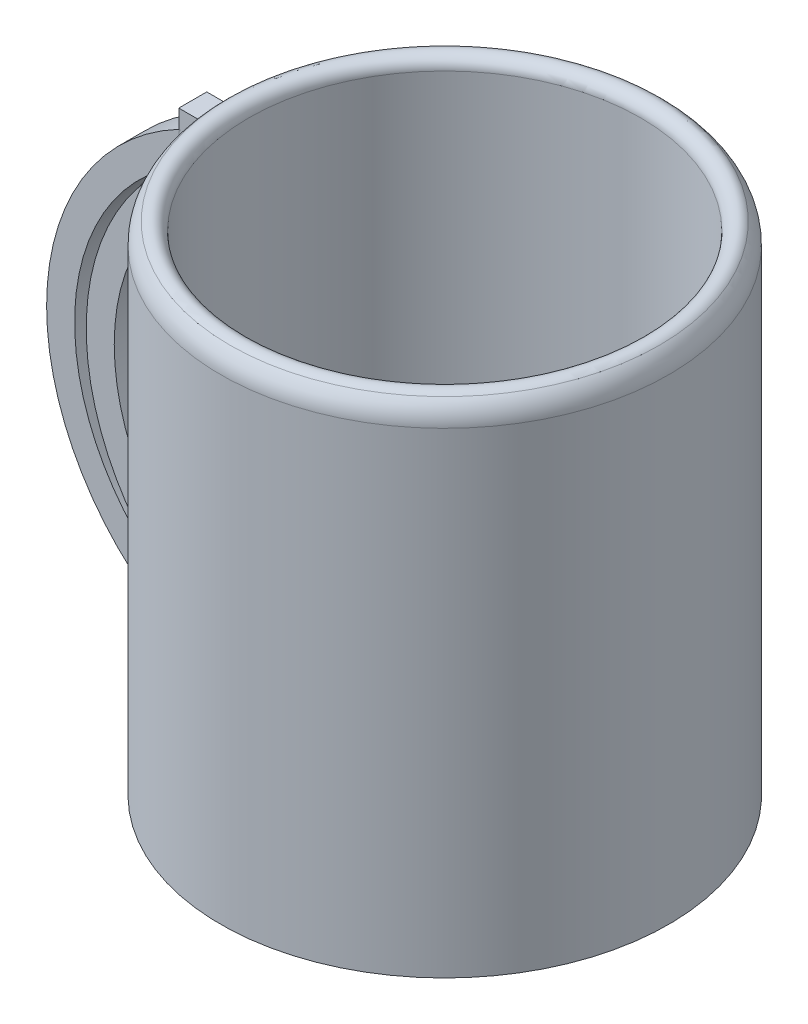
ISO-10303-21;
HEADER;
FILE_DESCRIPTION(('STEP AP214'),'2;1');
FILE_NAME('part.step','',(''),(''),'','','');
FILE_SCHEMA(('AUTOMOTIVE_DESIGN { 1 0 10303 214 1 1 1 1 }'));
ENDSEC;
DATA;
#1=APPLICATION_CONTEXT('core data for automotive mechanical design processes');
#2=APPLICATION_PROTOCOL_DEFINITION('international standard','automotive_design',2000,#1);
#3=PRODUCT_CONTEXT('',#1,'mechanical');
#4=PRODUCT('Part','Part','',(#3));
#5=PRODUCT_RELATED_PRODUCT_CATEGORY('part','',(#4));
#6=PRODUCT_DEFINITION_FORMATION('','',#4);
#7=PRODUCT_DEFINITION_CONTEXT('part definition',#1,'design');
#8=PRODUCT_DEFINITION('design','',#6,#7);
#9=PRODUCT_DEFINITION_SHAPE('','',#8);
#10=(LENGTH_UNIT() NAMED_UNIT(*) SI_UNIT(.MILLI.,.METRE.));
#11=(NAMED_UNIT(*) PLANE_ANGLE_UNIT() SI_UNIT($,.RADIAN.));
#12=(NAMED_UNIT(*) SI_UNIT($,.STERADIAN.) SOLID_ANGLE_UNIT());
#13=UNCERTAINTY_MEASURE_WITH_UNIT(LENGTH_MEASURE(1.E-05),#10,'distance_accuracy_value','');
#14=(GEOMETRIC_REPRESENTATION_CONTEXT(3) GLOBAL_UNCERTAINTY_ASSIGNED_CONTEXT((#13)) GLOBAL_UNIT_ASSIGNED_CONTEXT((#10,
#11,#12)) REPRESENTATION_CONTEXT('',''));
#15=CARTESIAN_POINT('',(0.,0.,0.));
#16=DIRECTION('',(0.,0.,1.));
#17=DIRECTION('',(1.,0.,0.));
#18=AXIS2_PLACEMENT_3D('',#15,#16,#17);
#19=CARTESIAN_POINT('',(-24.3812589804057,42.6071533146474,2.5));
#20=DIRECTION('',(0.,0.,-1.));
#21=DIRECTION('',(-1.,0.,0.));
#22=AXIS2_PLACEMENT_3D('',#19,#20,#21);
#23=CYLINDRICAL_SURFACE('',#22,44.2149505588136);
#24=CARTESIAN_POINT('',(-24.3812589804057,42.6071533146474,-2.5));
#25=DIRECTION('',(0.,0.,1.));
#26=DIRECTION('',(1.,0.,0.));
#27=AXIS2_PLACEMENT_3D('',#24,#25,#26);
#28=CIRCLE('',#27,44.2149505588136);
#29=CARTESIAN_POINT('',(-41.9914268406599,83.1638277450294,-2.5));
#30=VERTEX_POINT('',#29);
#31=CARTESIAN_POINT('',(-41.9914268406599,2.05047888426536,-2.5));
#32=VERTEX_POINT('',#31);
#33=EDGE_CURVE('E189',#30,#32,#28,.T.);
#34=ORIENTED_EDGE('',*,*,#33,.T.);
#35=DIRECTION('',(0.,0.,-1.));
#36=VECTOR('',#35,1.);
#37=CARTESIAN_POINT('',(-41.9914268406599,2.05047888426536,2.5));
#38=LINE('',#37,#36);
#39=CARTESIAN_POINT('',(-41.9914268406599,2.05047888426536,2.5));
#40=VERTEX_POINT('',#39);
#41=EDGE_CURVE('E13',#40,#32,#38,.T.);
#42=ORIENTED_EDGE('',*,*,#41,.F.);
#43=CARTESIAN_POINT('',(-24.3812589804057,42.6071533146474,2.5));
#44=DIRECTION('',(0.,0.,1.));
#45=DIRECTION('',(1.,0.,0.));
#46=AXIS2_PLACEMENT_3D('',#43,#44,#45);
#47=CIRCLE('',#46,44.2149505588136);
#48=CARTESIAN_POINT('',(-41.9914268406599,83.1638277450294,2.5));
#49=VERTEX_POINT('',#48);
#50=EDGE_CURVE('E166',#49,#40,#47,.T.);
#51=ORIENTED_EDGE('',*,*,#50,.F.);
#52=DIRECTION('',(0.,0.,-1.));
#53=VECTOR('',#52,1.);
#54=CARTESIAN_POINT('',(-41.9914268406599,83.1638277450294,2.5));
#55=LINE('',#54,#53);
#56=EDGE_CURVE('E142',#49,#30,#55,.T.);
#57=ORIENTED_EDGE('',*,*,#56,.T.);
#58=EDGE_LOOP('',(#34,#42,#51,#57));
#59=FACE_BOUND('',#58,.T.);
#60=ADVANCED_FACE('F126',(#59),#23,.T.);
#61=CARTESIAN_POINT('',(-40.,6.63678667357686,2.5));
#62=DIRECTION('',(0.917261557862301,-0.398285368131976,0.));
#63=DIRECTION('',(0.398285368131976,0.917261557862301,0.));
#64=AXIS2_PLACEMENT_3D('',#61,#62,#63);
#65=PLANE('',#64);
#66=DIRECTION('',(-0.398285368131976,-0.917261557862301,0.));
#67=VECTOR('',#66,1.);
#68=CARTESIAN_POINT('',(-40.,6.63678667357686,-2.5));
#69=LINE('',#68,#67);
#70=CARTESIAN_POINT('',(-40.,6.63678667357686,-2.5));
#71=VERTEX_POINT('',#70);
#72=EDGE_CURVE('E175',#71,#32,#69,.T.);
#73=ORIENTED_EDGE('',*,*,#72,.F.);
#74=DIRECTION('',(0.,0.,-1.));
#75=VECTOR('',#74,1.);
#76=CARTESIAN_POINT('',(-40.,6.63678667357686,2.5));
#77=LINE('',#76,#75);
#78=CARTESIAN_POINT('',(-40.,6.63678667357686,2.5));
#79=VERTEX_POINT('',#78);
#80=EDGE_CURVE('E134',#79,#71,#77,.T.);
#81=ORIENTED_EDGE('',*,*,#80,.F.);
#82=DIRECTION('',(-0.398285368131976,-0.917261557862301,0.));
#83=VECTOR('',#82,1.);
#84=CARTESIAN_POINT('',(-40.,6.63678667357686,2.5));
#85=LINE('',#84,#83);
#86=EDGE_CURVE('E173',#79,#40,#85,.T.);
#87=ORIENTED_EDGE('',*,*,#86,.T.);
#88=ORIENTED_EDGE('',*,*,#41,.T.);
#89=EDGE_LOOP('',(#73,#81,#87,#88));
#90=FACE_BOUND('',#89,.T.);
#91=ADVANCED_FACE('F172',(#90),#65,.T.);
#92=CARTESIAN_POINT('',(-24.3812589804057,42.6071533146474,2.5));
#93=DIRECTION('',(0.,0.,-1.));
#94=DIRECTION('',(-1.,0.,0.));
#95=AXIS2_PLACEMENT_3D('',#92,#93,#94);
#96=CYLINDRICAL_SURFACE('',#95,39.2149505588136);
#97=CARTESIAN_POINT('',(-24.3812589804057,42.6071533146474,-2.5));
#98=DIRECTION('',(0.,0.,1.));
#99=DIRECTION('',(1.,0.,0.));
#100=AXIS2_PLACEMENT_3D('',#97,#98,#99);
#101=CIRCLE('',#100,39.2149505588136);
#102=CARTESIAN_POINT('',(-40.,78.5775199557179,-2.5));
#103=VERTEX_POINT('',#102);
#104=EDGE_CURVE('E192',#103,#71,#101,.T.);
#105=ORIENTED_EDGE('',*,*,#104,.F.);
#106=DIRECTION('',(0.,0.,-1.));
#107=VECTOR('',#106,1.);
#108=CARTESIAN_POINT('',(-40.,78.5775199557179,2.5));
#109=LINE('',#108,#107);
#110=CARTESIAN_POINT('',(-40.,78.5775199557179,2.5));
#111=VERTEX_POINT('',#110);
#112=EDGE_CURVE('E155',#111,#103,#109,.T.);
#113=ORIENTED_EDGE('',*,*,#112,.F.);
#114=CARTESIAN_POINT('',(-24.3812589804057,42.6071533146474,2.5));
#115=DIRECTION('',(0.,0.,1.));
#116=DIRECTION('',(1.,0.,0.));
#117=AXIS2_PLACEMENT_3D('',#114,#115,#116);
#118=CIRCLE('',#117,39.2149505588136);
#119=EDGE_CURVE('E181',#111,#79,#118,.T.);
#120=ORIENTED_EDGE('',*,*,#119,.T.);
#121=ORIENTED_EDGE('',*,*,#80,.T.);
#122=EDGE_LOOP('',(#105,#113,#120,#121));
#123=FACE_BOUND('',#122,.T.);
#124=ADVANCED_FACE('F183',(#123),#96,.F.);
#125=CARTESIAN_POINT('',(-41.9914268406599,83.1638277450294,2.5));
#126=DIRECTION('',(0.917261557862302,0.398285368131974,0.));
#127=DIRECTION('',(-0.398285368131974,0.917261557862302,0.));
#128=AXIS2_PLACEMENT_3D('',#125,#126,#127);
#129=PLANE('',#128);
#130=DIRECTION('',(0.398285368131974,-0.917261557862302,0.));
#131=VECTOR('',#130,1.);
#132=CARTESIAN_POINT('',(-41.9914268406599,83.1638277450294,-2.5));
#133=LINE('',#132,#131);
#134=EDGE_CURVE('E194',#30,#103,#133,.T.);
#135=ORIENTED_EDGE('',*,*,#134,.F.);
#136=ORIENTED_EDGE('',*,*,#56,.F.);
#137=DIRECTION('',(0.398285368131974,-0.917261557862302,0.));
#138=VECTOR('',#137,1.);
#139=CARTESIAN_POINT('',(-41.9914268406599,83.1638277450294,2.5));
#140=LINE('',#139,#138);
#141=EDGE_CURVE('E184',#49,#111,#140,.T.);
#142=ORIENTED_EDGE('',*,*,#141,.T.);
#143=ORIENTED_EDGE('',*,*,#112,.T.);
#144=EDGE_LOOP('',(#135,#136,#142,#143));
#145=FACE_BOUND('',#144,.T.);
#146=ADVANCED_FACE('F200',(#145),#129,.T.);
#147=CARTESIAN_POINT('',(-24.3812589804057,42.6071533146474,2.5));
#148=DIRECTION('',(0.,0.,1.));
#149=DIRECTION('',(1.,0.,0.));
#150=AXIS2_PLACEMENT_3D('',#147,#148,#149);
#151=PLANE('',#150);
#152=ORIENTED_EDGE('',*,*,#50,.T.);
#153=ORIENTED_EDGE('',*,*,#86,.F.);
#154=ORIENTED_EDGE('',*,*,#119,.F.);
#155=ORIENTED_EDGE('',*,*,#141,.F.);
#156=EDGE_LOOP('',(#152,#153,#154,#155));
#157=FACE_BOUND('',#156,.T.);
#158=ADVANCED_FACE('F180',(#157),#151,.T.);
#159=CARTESIAN_POINT('',(-24.3812589804057,42.6071533146474,-2.5));
#160=DIRECTION('',(0.,0.,1.));
#161=DIRECTION('',(1.,0.,0.));
#162=AXIS2_PLACEMENT_3D('',#159,#160,#161);
#163=PLANE('',#162);
#164=ORIENTED_EDGE('',*,*,#33,.F.);
#165=ORIENTED_EDGE('',*,*,#134,.T.);
#166=ORIENTED_EDGE('',*,*,#104,.T.);
#167=ORIENTED_EDGE('',*,*,#72,.T.);
#168=EDGE_LOOP('',(#164,#165,#166,#167));
#169=FACE_BOUND('',#168,.T.);
#170=ADVANCED_FACE('F199',(#169),#163,.F.);
#171=CLOSED_SHELL('',(#60,#91,#124,#146,#158,#170));
#172=MANIFOLD_SOLID_BREP('B2',#171);
#173=CARTESIAN_POINT('',(-19.3818792111372,42.6859056011428,2.5));
#174=DIRECTION('',(0.,0.,-1.));
#175=DIRECTION('',(-1.,0.,0.));
#176=AXIS2_PLACEMENT_3D('',#173,#174,#175);
#177=CYLINDRICAL_SURFACE('',#176,42.1402577036822);
#178=CARTESIAN_POINT('',(-19.3818792111372,42.6859056011428,-2.5));
#179=DIRECTION('',(0.,0.,1.));
#180=DIRECTION('',(1.,0.,0.));
#181=AXIS2_PLACEMENT_3D('',#178,#179,#180);
#182=CIRCLE('',#181,42.1402577036822);
#183=CARTESIAN_POINT('',(-42.7757105178646,77.7362975550871,-2.5));
#184=VERTEX_POINT('',#183);
#185=CARTESIAN_POINT('',(-42.7757105178647,7.63551364719855,-2.5));
#186=VERTEX_POINT('',#185);
#187=EDGE_CURVE('E323',#184,#186,#182,.T.);
#188=ORIENTED_EDGE('',*,*,#187,.T.);
#189=DIRECTION('',(0.,0.,-1.));
#190=VECTOR('',#189,1.);
#191=CARTESIAN_POINT('',(-42.7757105178647,7.63551364719855,2.5));
#192=LINE('',#191,#190);
#193=CARTESIAN_POINT('',(-42.7757105178647,7.63551364719855,2.5));
#194=VERTEX_POINT('',#193);
#195=EDGE_CURVE('E124',#194,#186,#192,.T.);
#196=ORIENTED_EDGE('',*,*,#195,.F.);
#197=CARTESIAN_POINT('',(-19.3818792111372,42.6859056011428,2.5));
#198=DIRECTION('',(0.,0.,1.));
#199=DIRECTION('',(1.,0.,0.));
#200=AXIS2_PLACEMENT_3D('',#197,#198,#199);
#201=CIRCLE('',#200,42.1402577036822);
#202=CARTESIAN_POINT('',(-42.7757105178646,77.7362975550871,2.5));
#203=VERTEX_POINT('',#202);
#204=EDGE_CURVE('E300',#203,#194,#201,.T.);
#205=ORIENTED_EDGE('',*,*,#204,.F.);
#206=DIRECTION('',(0.,0.,-1.));
#207=VECTOR('',#206,1.);
#208=CARTESIAN_POINT('',(-42.7757105178646,77.7362975550871,2.5));
#209=LINE('',#208,#207);
#210=EDGE_CURVE('E276',#203,#184,#209,.T.);
#211=ORIENTED_EDGE('',*,*,#210,.T.);
#212=EDGE_LOOP('',(#188,#196,#205,#211));
#213=FACE_BOUND('',#212,.T.);
#214=ADVANCED_FACE('F260',(#213),#177,.T.);
#215=CARTESIAN_POINT('',(-40.,11.7942912465678,2.5));
#216=DIRECTION('',(0.831755519873848,-0.555142103572936,0.));
#217=DIRECTION('',(0.555142103572936,0.831755519873848,0.));
#218=AXIS2_PLACEMENT_3D('',#215,#216,#217);
#219=PLANE('',#218);
#220=DIRECTION('',(-0.555142103572936,-0.831755519873848,0.));
#221=VECTOR('',#220,1.);
#222=CARTESIAN_POINT('',(-40.,11.7942912465678,-2.5));
#223=LINE('',#222,#221);
#224=CARTESIAN_POINT('',(-40.,11.7942912465678,-2.5));
#225=VERTEX_POINT('',#224);
#226=EDGE_CURVE('E309',#225,#186,#223,.T.);
#227=ORIENTED_EDGE('',*,*,#226,.F.);
#228=DIRECTION('',(0.,0.,-1.));
#229=VECTOR('',#228,1.);
#230=CARTESIAN_POINT('',(-40.,11.7942912465678,2.5));
#231=LINE('',#230,#229);
#232=CARTESIAN_POINT('',(-40.,11.7942912465678,2.5));
#233=VERTEX_POINT('',#232);
#234=EDGE_CURVE('E268',#233,#225,#231,.T.);
#235=ORIENTED_EDGE('',*,*,#234,.F.);
#236=DIRECTION('',(-0.555142103572936,-0.831755519873848,0.));
#237=VECTOR('',#236,1.);
#238=CARTESIAN_POINT('',(-40.,11.7942912465678,2.5));
#239=LINE('',#238,#237);
#240=EDGE_CURVE('E307',#233,#194,#239,.T.);
#241=ORIENTED_EDGE('',*,*,#240,.T.);
#242=ORIENTED_EDGE('',*,*,#195,.T.);
#243=EDGE_LOOP('',(#227,#235,#241,#242));
#244=FACE_BOUND('',#243,.T.);
#245=ADVANCED_FACE('F306',(#244),#219,.T.);
#246=CARTESIAN_POINT('',(-19.3818792111372,42.6859056011428,2.5));
#247=DIRECTION('',(0.,0.,-1.));
#248=DIRECTION('',(-1.,0.,0.));
#249=AXIS2_PLACEMENT_3D('',#246,#247,#248);
#250=CYLINDRICAL_SURFACE('',#249,37.1402577036822);
#251=CARTESIAN_POINT('',(-19.3818792111372,42.6859056011428,-2.5));
#252=DIRECTION('',(0.,0.,1.));
#253=DIRECTION('',(1.,0.,0.));
#254=AXIS2_PLACEMENT_3D('',#251,#252,#253);
#255=CIRCLE('',#254,37.1402577036822);
#256=CARTESIAN_POINT('',(-40.,73.5775199557179,-2.5));
#257=VERTEX_POINT('',#256);
#258=EDGE_CURVE('E326',#257,#225,#255,.T.);
#259=ORIENTED_EDGE('',*,*,#258,.F.);
#260=DIRECTION('',(0.,0.,-1.));
#261=VECTOR('',#260,1.);
#262=CARTESIAN_POINT('',(-40.,73.5775199557179,2.5));
#263=LINE('',#262,#261);
#264=CARTESIAN_POINT('',(-40.,73.5775199557179,2.5));
#265=VERTEX_POINT('',#264);
#266=EDGE_CURVE('E289',#265,#257,#263,.T.);
#267=ORIENTED_EDGE('',*,*,#266,.F.);
#268=CARTESIAN_POINT('',(-19.3818792111372,42.6859056011428,2.5));
#269=DIRECTION('',(0.,0.,1.));
#270=DIRECTION('',(1.,0.,0.));
#271=AXIS2_PLACEMENT_3D('',#268,#269,#270);
#272=CIRCLE('',#271,37.1402577036822);
#273=EDGE_CURVE('E315',#265,#233,#272,.T.);
#274=ORIENTED_EDGE('',*,*,#273,.T.);
#275=ORIENTED_EDGE('',*,*,#234,.T.);
#276=EDGE_LOOP('',(#259,#267,#274,#275));
#277=FACE_BOUND('',#276,.T.);
#278=ADVANCED_FACE('F317',(#277),#250,.F.);
#279=CARTESIAN_POINT('',(-42.7757105178646,77.7362975550871,2.5));
#280=DIRECTION('',(0.831755519873853,0.555142103572929,0.));
#281=DIRECTION('',(-0.555142103572929,0.831755519873853,0.));
#282=AXIS2_PLACEMENT_3D('',#279,#280,#281);
#283=PLANE('',#282);
#284=DIRECTION('',(0.555142103572929,-0.831755519873853,0.));
#285=VECTOR('',#284,1.);
#286=CARTESIAN_POINT('',(-42.7757105178646,77.7362975550871,-2.5));
#287=LINE('',#286,#285);
#288=EDGE_CURVE('E328',#184,#257,#287,.T.);
#289=ORIENTED_EDGE('',*,*,#288,.F.);
#290=ORIENTED_EDGE('',*,*,#210,.F.);
#291=DIRECTION('',(0.555142103572929,-0.831755519873853,0.));
#292=VECTOR('',#291,1.);
#293=CARTESIAN_POINT('',(-42.7757105178646,77.7362975550871,2.5));
#294=LINE('',#293,#292);
#295=EDGE_CURVE('E318',#203,#265,#294,.T.);
#296=ORIENTED_EDGE('',*,*,#295,.T.);
#297=ORIENTED_EDGE('',*,*,#266,.T.);
#298=EDGE_LOOP('',(#289,#290,#296,#297));
#299=FACE_BOUND('',#298,.T.);
#300=ADVANCED_FACE('F334',(#299),#283,.T.);
#301=CARTESIAN_POINT('',(-19.3818792111372,42.6859056011428,2.5));
#302=DIRECTION('',(0.,0.,1.));
#303=DIRECTION('',(1.,0.,0.));
#304=AXIS2_PLACEMENT_3D('',#301,#302,#303);
#305=PLANE('',#304);
#306=ORIENTED_EDGE('',*,*,#204,.T.);
#307=ORIENTED_EDGE('',*,*,#240,.F.);
#308=ORIENTED_EDGE('',*,*,#273,.F.);
#309=ORIENTED_EDGE('',*,*,#295,.F.);
#310=EDGE_LOOP('',(#306,#307,#308,#309));
#311=FACE_BOUND('',#310,.T.);
#312=ADVANCED_FACE('F314',(#311),#305,.T.);
#313=CARTESIAN_POINT('',(-19.3818792111372,42.6859056011428,-2.5));
#314=DIRECTION('',(0.,0.,1.));
#315=DIRECTION('',(1.,0.,0.));
#316=AXIS2_PLACEMENT_3D('',#313,#314,#315);
#317=PLANE('',#316);
#318=ORIENTED_EDGE('',*,*,#187,.F.);
#319=ORIENTED_EDGE('',*,*,#288,.T.);
#320=ORIENTED_EDGE('',*,*,#258,.T.);
#321=ORIENTED_EDGE('',*,*,#226,.T.);
#322=EDGE_LOOP('',(#318,#319,#320,#321));
#323=FACE_BOUND('',#322,.T.);
#324=ADVANCED_FACE('F333',(#323),#317,.F.);
#325=CLOSED_SHELL('',(#214,#245,#278,#300,#312,#324));
#326=MANIFOLD_SOLID_BREP('B7',#325);
#327=CARTESIAN_POINT('',(-45.,85.,2.5));
#328=DIRECTION('',(1.,0.,0.));
#329=DIRECTION('',(0.,1.,0.));
#330=AXIS2_PLACEMENT_3D('',#327,#328,#329);
#331=PLANE('',#330);
#332=DIRECTION('',(0.,-1.,0.));
#333=VECTOR('',#332,1.);
#334=CARTESIAN_POINT('',(-45.,85.,-2.5));
#335=LINE('',#334,#333);
#336=CARTESIAN_POINT('',(-45.,85.,-2.5));
#337=VERTEX_POINT('',#336);
#338=CARTESIAN_POINT('',(-45.,0.,-2.5));
#339=VERTEX_POINT('',#338);
#340=EDGE_CURVE('E456',#337,#339,#335,.T.);
#341=ORIENTED_EDGE('',*,*,#340,.T.);
#342=DIRECTION('',(0.,0.,-1.));
#343=VECTOR('',#342,1.);
#344=CARTESIAN_POINT('',(-45.,0.,2.5));
#345=LINE('',#344,#343);
#346=CARTESIAN_POINT('',(-45.,0.,2.5));
#347=VERTEX_POINT('',#346);
#348=EDGE_CURVE('E258',#347,#339,#345,.T.);
#349=ORIENTED_EDGE('',*,*,#348,.F.);
#350=DIRECTION('',(0.,-1.,0.));
#351=VECTOR('',#350,1.);
#352=CARTESIAN_POINT('',(-45.,85.,2.5));
#353=LINE('',#352,#351);
#354=CARTESIAN_POINT('',(-45.,85.,2.5));
#355=VERTEX_POINT('',#354);
#356=EDGE_CURVE('E433',#355,#347,#353,.T.);
#357=ORIENTED_EDGE('',*,*,#356,.F.);
#358=DIRECTION('',(0.,0.,-1.));
#359=VECTOR('',#358,1.);
#360=CARTESIAN_POINT('',(-45.,85.,2.5));
#361=LINE('',#360,#359);
#362=EDGE_CURVE('E409',#355,#337,#361,.T.);
#363=ORIENTED_EDGE('',*,*,#362,.T.);
#364=EDGE_LOOP('',(#341,#349,#357,#363));
#365=FACE_BOUND('',#364,.T.);
#366=ADVANCED_FACE('F393',(#365),#331,.F.);
#367=CARTESIAN_POINT('',(-40.,0.,2.5));
#368=DIRECTION('',(0.,-1.,0.));
#369=DIRECTION('',(0.,0.,-1.));
#370=AXIS2_PLACEMENT_3D('',#367,#368,#369);
#371=PLANE('',#370);
#372=DIRECTION('',(-1.,0.,0.));
#373=VECTOR('',#372,1.);
#374=CARTESIAN_POINT('',(-40.,0.,-2.5));
#375=LINE('',#374,#373);
#376=CARTESIAN_POINT('',(-40.,0.,-2.5));
#377=VERTEX_POINT('',#376);
#378=EDGE_CURVE('E442',#377,#339,#375,.T.);
#379=ORIENTED_EDGE('',*,*,#378,.F.);
#380=DIRECTION('',(0.,0.,-1.));
#381=VECTOR('',#380,1.);
#382=CARTESIAN_POINT('',(-40.,0.,2.5));
#383=LINE('',#382,#381);
#384=CARTESIAN_POINT('',(-40.,0.,2.5));
#385=VERTEX_POINT('',#384);
#386=EDGE_CURVE('E401',#385,#377,#383,.T.);
#387=ORIENTED_EDGE('',*,*,#386,.F.);
#388=DIRECTION('',(-1.,0.,0.));
#389=VECTOR('',#388,1.);
#390=CARTESIAN_POINT('',(-40.,0.,2.5));
#391=LINE('',#390,#389);
#392=EDGE_CURVE('E440',#385,#347,#391,.T.);
#393=ORIENTED_EDGE('',*,*,#392,.T.);
#394=ORIENTED_EDGE('',*,*,#348,.T.);
#395=EDGE_LOOP('',(#379,#387,#393,#394));
#396=FACE_BOUND('',#395,.T.);
#397=ADVANCED_FACE('F439',(#396),#371,.T.);
#398=CARTESIAN_POINT('',(-40.,85.,2.5));
#399=DIRECTION('',(1.,0.,0.));
#400=DIRECTION('',(0.,1.,0.));
#401=AXIS2_PLACEMENT_3D('',#398,#399,#400);
#402=PLANE('',#401);
#403=DIRECTION('',(0.,-1.,0.));
#404=VECTOR('',#403,1.);
#405=CARTESIAN_POINT('',(-40.,85.,-2.5));
#406=LINE('',#405,#404);
#407=CARTESIAN_POINT('',(-40.,85.,-2.5));
#408=VERTEX_POINT('',#407);
#409=EDGE_CURVE('E459',#408,#377,#406,.T.);
#410=ORIENTED_EDGE('',*,*,#409,.F.);
#411=DIRECTION('',(0.,0.,-1.));
#412=VECTOR('',#411,1.);
#413=CARTESIAN_POINT('',(-40.,85.,2.5));
#414=LINE('',#413,#412);
#415=CARTESIAN_POINT('',(-40.,85.,2.5));
#416=VERTEX_POINT('',#415);
#417=EDGE_CURVE('E422',#416,#408,#414,.T.);
#418=ORIENTED_EDGE('',*,*,#417,.F.);
#419=DIRECTION('',(0.,-1.,0.));
#420=VECTOR('',#419,1.);
#421=CARTESIAN_POINT('',(-40.,85.,2.5));
#422=LINE('',#421,#420);
#423=EDGE_CURVE('E448',#416,#385,#422,.T.);
#424=ORIENTED_EDGE('',*,*,#423,.T.);
#425=ORIENTED_EDGE('',*,*,#386,.T.);
#426=EDGE_LOOP('',(#410,#418,#424,#425));
#427=FACE_BOUND('',#426,.T.);
#428=ADVANCED_FACE('F450',(#427),#402,.T.);
#429=CARTESIAN_POINT('',(-45.,85.,2.5));
#430=DIRECTION('',(0.,1.,0.));
#431=DIRECTION('',(0.,0.,1.));
#432=AXIS2_PLACEMENT_3D('',#429,#430,#431);
#433=PLANE('',#432);
#434=DIRECTION('',(1.,0.,0.));
#435=VECTOR('',#434,1.);
#436=CARTESIAN_POINT('',(-45.,85.,-2.5));
#437=LINE('',#436,#435);
#438=EDGE_CURVE('E461',#337,#408,#437,.T.);
#439=ORIENTED_EDGE('',*,*,#438,.F.);
#440=ORIENTED_EDGE('',*,*,#362,.F.);
#441=DIRECTION('',(1.,0.,0.));
#442=VECTOR('',#441,1.);
#443=CARTESIAN_POINT('',(-45.,85.,2.5));
#444=LINE('',#443,#442);
#445=EDGE_CURVE('E451',#355,#416,#444,.T.);
#446=ORIENTED_EDGE('',*,*,#445,.T.);
#447=ORIENTED_EDGE('',*,*,#417,.T.);
#448=EDGE_LOOP('',(#439,#440,#446,#447));
#449=FACE_BOUND('',#448,.T.);
#450=ADVANCED_FACE('F467',(#449),#433,.T.);
#451=CARTESIAN_POINT('',(0.,0.,2.5));
#452=DIRECTION('',(0.,0.,-1.));
#453=DIRECTION('',(-1.,0.,0.));
#454=AXIS2_PLACEMENT_3D('',#451,#452,#453);
#455=PLANE('',#454);
#456=ORIENTED_EDGE('',*,*,#356,.T.);
#457=ORIENTED_EDGE('',*,*,#392,.F.);
#458=ORIENTED_EDGE('',*,*,#423,.F.);
#459=ORIENTED_EDGE('',*,*,#445,.F.);
#460=EDGE_LOOP('',(#456,#457,#458,#459));
#461=FACE_BOUND('',#460,.T.);
#462=ADVANCED_FACE('F447',(#461),#455,.F.);
#463=CARTESIAN_POINT('',(0.,0.,-2.5));
#464=DIRECTION('',(0.,0.,-1.));
#465=DIRECTION('',(-1.,0.,0.));
#466=AXIS2_PLACEMENT_3D('',#463,#464,#465);
#467=PLANE('',#466);
#468=ORIENTED_EDGE('',*,*,#340,.F.);
#469=ORIENTED_EDGE('',*,*,#438,.T.);
#470=ORIENTED_EDGE('',*,*,#409,.T.);
#471=ORIENTED_EDGE('',*,*,#378,.T.);
#472=EDGE_LOOP('',(#468,#469,#470,#471));
#473=FACE_BOUND('',#472,.T.);
#474=ADVANCED_FACE('F466',(#473),#467,.T.);
#475=CLOSED_SHELL('',(#366,#397,#428,#450,#462,#474));
#476=MANIFOLD_SOLID_BREP('B118',#475);
#477=CARTESIAN_POINT('',(0.,87.2360679774998,0.));
#478=DIRECTION('',(0.,1.,0.));
#479=DIRECTION('',(0.,0.,1.));
#480=AXIS2_PLACEMENT_3D('',#477,#478,#479);
#481=TOROIDAL_SURFACE('',#480,37.,2.);
#482=CARTESIAN_POINT('',(0.,88.7267799624996,0.));
#483=DIRECTION('',(0.,-1.,0.));
#484=DIRECTION('',(0.,0.,-1.));
#485=AXIS2_PLACEMENT_3D('',#482,#483,#484);
#486=CIRCLE('',#485,38.3333333333333);
#487=CARTESIAN_POINT('',(0.,88.7267799624996,-38.3333333333333));
#488=VERTEX_POINT('',#487);
#489=EDGE_CURVE('E525',#488,#488,#486,.T.);
#490=ORIENTED_EDGE('',*,*,#489,.F.);
#491=EDGE_LOOP('',(#490));
#492=FACE_BOUND('',#491,.T.);
#493=CARTESIAN_POINT('',(0.,87.2360679774998,0.));
#494=DIRECTION('',(0.,1.,0.));
#495=DIRECTION('',(0.,0.,1.));
#496=AXIS2_PLACEMENT_3D('',#493,#494,#495);
#497=CIRCLE('',#496,35.);
#498=CARTESIAN_POINT('',(0.,87.2360679774998,35.));
#499=VERTEX_POINT('',#498);
#500=EDGE_CURVE('E391',#499,#499,#497,.T.);
#501=ORIENTED_EDGE('',*,*,#500,.F.);
#502=EDGE_LOOP('',(#501));
#503=FACE_BOUND('',#502,.T.);
#504=ADVANCED_FACE('F517',(#492,#503),#481,.T.);
#505=CARTESIAN_POINT('',(0.,85.,0.));
#506=DIRECTION('',(0.,-1.,0.));
#507=DIRECTION('',(0.,0.,-1.));
#508=AXIS2_PLACEMENT_3D('',#505,#506,#507);
#509=TOROIDAL_SURFACE('',#508,35.,5.);
#510=ORIENTED_EDGE('',*,*,#489,.T.);
#511=EDGE_LOOP('',(#510));
#512=FACE_BOUND('',#511,.T.);
#513=CARTESIAN_POINT('',(0.,85.,0.));
#514=DIRECTION('',(0.,-1.,0.));
#515=DIRECTION('',(0.,0.,-1.));
#516=AXIS2_PLACEMENT_3D('',#513,#514,#515);
#517=CIRCLE('',#516,40.);
#518=CARTESIAN_POINT('',(0.,85.,-40.));
#519=VERTEX_POINT('',#518);
#520=EDGE_CURVE('E550',#519,#519,#517,.T.);
#521=ORIENTED_EDGE('',*,*,#520,.F.);
#522=EDGE_LOOP('',(#521));
#523=FACE_BOUND('',#522,.T.);
#524=ADVANCED_FACE('F574',(#512,#523),#509,.T.);
#525=CARTESIAN_POINT('',(0.,0.,0.));
#526=DIRECTION('',(0.,1.,0.));
#527=DIRECTION('',(0.,0.,1.));
#528=AXIS2_PLACEMENT_3D('',#525,#526,#527);
#529=PLANE('',#528);
#530=CARTESIAN_POINT('',(0.,0.,0.));
#531=DIRECTION('',(0.,-1.,0.));
#532=DIRECTION('',(0.,0.,-1.));
#533=AXIS2_PLACEMENT_3D('',#530,#531,#532);
#534=CIRCLE('',#533,40.);
#535=CARTESIAN_POINT('',(0.,0.,-40.));
#536=VERTEX_POINT('',#535);
#537=EDGE_CURVE('E547',#536,#536,#534,.T.);
#538=ORIENTED_EDGE('',*,*,#537,.T.);
#539=EDGE_LOOP('',(#538));
#540=FACE_BOUND('',#539,.T.);
#541=ADVANCED_FACE('F542',(#540),#529,.F.);
#542=CARTESIAN_POINT('',(0.,0.,0.));
#543=DIRECTION('',(0.,-1.,0.));
#544=DIRECTION('',(0.,0.,-1.));
#545=AXIS2_PLACEMENT_3D('',#542,#543,#544);
#546=CYLINDRICAL_SURFACE('',#545,40.);
#547=CARTESIAN_POINT('',(-40.,6.63678667357686,0.));
#548=VERTEX_POINT('',#547);
#549=VERTEX_LOOP('',#548);
#550=FACE_BOUND('',#549,.T.);
#551=CARTESIAN_POINT('',(-40.,78.5775199557179,0.));
#552=VERTEX_POINT('',#551);
#553=VERTEX_LOOP('',#552);
#554=FACE_BOUND('',#553,.T.);
#555=CARTESIAN_POINT('',(-40.,11.7942912465678,0.));
#556=VERTEX_POINT('',#555);
#557=VERTEX_LOOP('',#556);
#558=FACE_BOUND('',#557,.T.);
#559=CARTESIAN_POINT('',(-40.,73.5775199557179,0.));
#560=VERTEX_POINT('',#559);
#561=VERTEX_LOOP('',#560);
#562=FACE_BOUND('',#561,.T.);
#563=ORIENTED_EDGE('',*,*,#537,.F.);
#564=EDGE_LOOP('',(#563));
#565=FACE_BOUND('',#564,.T.);
#566=ORIENTED_EDGE('',*,*,#520,.T.);
#567=EDGE_LOOP('',(#566));
#568=FACE_BOUND('',#567,.T.);
#569=ADVANCED_FACE('F538',(#550,#554,#558,#562,#565,#568),#546,.T.);
#570=CARTESIAN_POINT('',(0.,9.99999999999999,0.));
#571=DIRECTION('',(0.,1.,0.));
#572=DIRECTION('',(0.,0.,1.));
#573=AXIS2_PLACEMENT_3D('',#570,#571,#572);
#574=CYLINDRICAL_SURFACE('',#573,35.);
#575=ORIENTED_EDGE('',*,*,#500,.T.);
#576=EDGE_LOOP('',(#575));
#577=FACE_BOUND('',#576,.T.);
#578=CARTESIAN_POINT('',(0.,9.99999999999999,0.));
#579=DIRECTION('',(0.,1.,0.));
#580=DIRECTION('',(0.,0.,1.));
#581=AXIS2_PLACEMENT_3D('',#578,#579,#580);
#582=CIRCLE('',#581,35.);
#583=CARTESIAN_POINT('',(0.,9.99999999999999,35.));
#584=VERTEX_POINT('',#583);
#585=EDGE_CURVE('E557',#584,#584,#582,.T.);
#586=ORIENTED_EDGE('',*,*,#585,.F.);
#587=EDGE_LOOP('',(#586));
#588=FACE_BOUND('',#587,.T.);
#589=ADVANCED_FACE('F541',(#577,#588),#574,.F.);
#590=CARTESIAN_POINT('',(0.,9.99999999999999,0.));
#591=DIRECTION('',(0.,1.,0.));
#592=DIRECTION('',(0.,0.,1.));
#593=AXIS2_PLACEMENT_3D('',#590,#591,#592);
#594=PLANE('',#593);
#595=ORIENTED_EDGE('',*,*,#585,.T.);
#596=EDGE_LOOP('',(#595));
#597=FACE_BOUND('',#596,.T.);
#598=ADVANCED_FACE('F564',(#597),#594,.T.);
#599=CLOSED_SHELL('',(#504,#524,#541,#569,#589,#598));
#600=MANIFOLD_SOLID_BREP('B252',#599);
#601=ADVANCED_BREP_SHAPE_REPRESENTATION('',(#18,#172,#326,#476,#600),#14);
#602=SHAPE_DEFINITION_REPRESENTATION(#9,#601);
ENDSEC;
END-ISO-10303-21;
